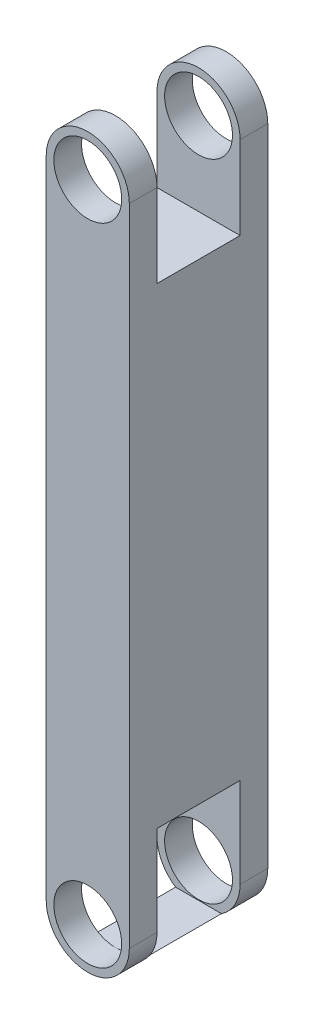
ISO-10303-21;
HEADER;
FILE_DESCRIPTION(('STEP AP214'),'2;1');
FILE_NAME('part.step','',(''),(''),'','','');
FILE_SCHEMA(('AUTOMOTIVE_DESIGN { 1 0 10303 214 1 1 1 1 }'));
ENDSEC;
DATA;
#1=APPLICATION_CONTEXT('core data for automotive mechanical design processes');
#2=APPLICATION_PROTOCOL_DEFINITION('international standard','automotive_design',2000,#1);
#3=PRODUCT_CONTEXT('',#1,'mechanical');
#4=PRODUCT('Part','Part','',(#3));
#5=PRODUCT_RELATED_PRODUCT_CATEGORY('part','',(#4));
#6=PRODUCT_DEFINITION_FORMATION('','',#4);
#7=PRODUCT_DEFINITION_CONTEXT('part definition',#1,'design');
#8=PRODUCT_DEFINITION('design','',#6,#7);
#9=PRODUCT_DEFINITION_SHAPE('','',#8);
#10=(LENGTH_UNIT() NAMED_UNIT(*) SI_UNIT(.MILLI.,.METRE.));
#11=(NAMED_UNIT(*) PLANE_ANGLE_UNIT() SI_UNIT($,.RADIAN.));
#12=(NAMED_UNIT(*) SI_UNIT($,.STERADIAN.) SOLID_ANGLE_UNIT());
#13=UNCERTAINTY_MEASURE_WITH_UNIT(LENGTH_MEASURE(1.E-05),#10,'distance_accuracy_value','');
#14=(GEOMETRIC_REPRESENTATION_CONTEXT(3) GLOBAL_UNCERTAINTY_ASSIGNED_CONTEXT((#13)) GLOBAL_UNIT_ASSIGNED_CONTEXT((#10,
#11,#12)) REPRESENTATION_CONTEXT('',''));
#15=CARTESIAN_POINT('',(0.,0.,0.));
#16=DIRECTION('',(0.,0.,1.));
#17=DIRECTION('',(1.,0.,0.));
#18=AXIS2_PLACEMENT_3D('',#15,#16,#17);
#19=CARTESIAN_POINT('',(0.,46.58,-5.));
#20=DIRECTION('',(0.,0.,1.));
#21=DIRECTION('',(1.,0.,0.));
#22=AXIS2_PLACEMENT_3D('',#19,#20,#21);
#23=CYLINDRICAL_SURFACE('',#22,3.);
#24=CARTESIAN_POINT('',(0.,46.58,3.));
#25=DIRECTION('',(0.,0.,1.));
#26=DIRECTION('',(0.,-1.,0.));
#27=AXIS2_PLACEMENT_3D('',#24,#25,#26);
#28=CIRCLE('',#27,3.);
#29=CARTESIAN_POINT('',(-3.,46.58,3.));
#30=VERTEX_POINT('',#29);
#31=CARTESIAN_POINT('',(3.,46.58,3.));
#32=VERTEX_POINT('',#31);
#33=EDGE_CURVE('E139',#30,#32,#28,.F.);
#34=ORIENTED_EDGE('',*,*,#33,.F.);
#35=DIRECTION('',(0.,0.,1.));
#36=VECTOR('',#35,1.);
#37=CARTESIAN_POINT('',(-3.,46.58,-5.));
#38=LINE('',#37,#36);
#39=CARTESIAN_POINT('',(-3.,46.58,5.));
#40=VERTEX_POINT('',#39);
#41=EDGE_CURVE('E240',#30,#40,#38,.T.);
#42=ORIENTED_EDGE('',*,*,#41,.T.);
#43=CARTESIAN_POINT('',(0.,46.58,5.));
#44=DIRECTION('',(0.,0.,1.));
#45=DIRECTION('',(-1.,0.,0.));
#46=AXIS2_PLACEMENT_3D('',#43,#44,#45);
#47=CIRCLE('',#46,3.);
#48=CARTESIAN_POINT('',(3.,46.58,5.));
#49=VERTEX_POINT('',#48);
#50=EDGE_CURVE('E210',#49,#40,#47,.T.);
#51=ORIENTED_EDGE('',*,*,#50,.F.);
#52=DIRECTION('',(0.,0.,1.));
#53=VECTOR('',#52,1.);
#54=CARTESIAN_POINT('',(3.,46.58,-5.));
#55=LINE('',#54,#53);
#56=EDGE_CURVE('E243',#32,#49,#55,.T.);
#57=ORIENTED_EDGE('',*,*,#56,.F.);
#58=EDGE_LOOP('',(#34,#42,#51,#57));
#59=FACE_BOUND('',#58,.T.);
#60=ADVANCED_FACE('F33',(#59),#23,.T.);
#61=CARTESIAN_POINT('',(0.,0.,-5.));
#62=DIRECTION('',(0.,0.,1.));
#63=DIRECTION('',(1.,0.,0.));
#64=AXIS2_PLACEMENT_3D('',#61,#62,#63);
#65=CYLINDRICAL_SURFACE('',#64,2.45);
#66=CARTESIAN_POINT('',(0.,0.,3.));
#67=DIRECTION('',(0.,0.,1.));
#68=DIRECTION('',(0.,-1.,0.));
#69=AXIS2_PLACEMENT_3D('',#66,#67,#68);
#70=CIRCLE('',#69,2.45);
#71=CARTESIAN_POINT('',(0.,-2.45,3.));
#72=VERTEX_POINT('',#71);
#73=EDGE_CURVE('E203',#72,#72,#70,.F.);
#74=ORIENTED_EDGE('',*,*,#73,.T.);
#75=EDGE_LOOP('',(#74));
#76=FACE_BOUND('',#75,.T.);
#77=CARTESIAN_POINT('',(0.,0.,5.));
#78=DIRECTION('',(0.,0.,1.));
#79=DIRECTION('',(1.,0.,0.));
#80=AXIS2_PLACEMENT_3D('',#77,#78,#79);
#81=CIRCLE('',#80,2.45);
#82=CARTESIAN_POINT('',(2.45,0.,5.));
#83=VERTEX_POINT('',#82);
#84=EDGE_CURVE('E207',#83,#83,#81,.T.);
#85=ORIENTED_EDGE('',*,*,#84,.T.);
#86=EDGE_LOOP('',(#85));
#87=FACE_BOUND('',#86,.T.);
#88=ADVANCED_FACE('F311',(#76,#87),#65,.F.);
#89=CARTESIAN_POINT('',(0.,46.58,-5.));
#90=DIRECTION('',(0.,0.,1.));
#91=DIRECTION('',(1.,0.,0.));
#92=AXIS2_PLACEMENT_3D('',#89,#90,#91);
#93=CYLINDRICAL_SURFACE('',#92,2.45);
#94=CARTESIAN_POINT('',(0.,46.58,3.));
#95=DIRECTION('',(0.,0.,1.));
#96=DIRECTION('',(0.,-1.,0.));
#97=AXIS2_PLACEMENT_3D('',#94,#95,#96);
#98=CIRCLE('',#97,2.45);
#99=CARTESIAN_POINT('',(0.,44.13,3.));
#100=VERTEX_POINT('',#99);
#101=EDGE_CURVE('E194',#100,#100,#98,.F.);
#102=ORIENTED_EDGE('',*,*,#101,.T.);
#103=EDGE_LOOP('',(#102));
#104=FACE_BOUND('',#103,.T.);
#105=CARTESIAN_POINT('',(0.,46.58,5.));
#106=DIRECTION('',(0.,0.,1.));
#107=DIRECTION('',(1.,0.,0.));
#108=AXIS2_PLACEMENT_3D('',#105,#106,#107);
#109=CIRCLE('',#108,2.45);
#110=CARTESIAN_POINT('',(2.45,46.58,5.));
#111=VERTEX_POINT('',#110);
#112=EDGE_CURVE('E204',#111,#111,#109,.T.);
#113=ORIENTED_EDGE('',*,*,#112,.T.);
#114=EDGE_LOOP('',(#113));
#115=FACE_BOUND('',#114,.T.);
#116=ADVANCED_FACE('F314',(#104,#115),#93,.F.);
#117=CARTESIAN_POINT('',(0.,46.58,-3.));
#118=DIRECTION('',(0.,0.,-1.));
#119=DIRECTION('',(0.,1.,0.));
#120=AXIS2_PLACEMENT_3D('',#117,#118,#119);
#121=CIRCLE('',#120,3.);
#122=CARTESIAN_POINT('',(3.,46.58,-3.));
#123=VERTEX_POINT('',#122);
#124=CARTESIAN_POINT('',(-3.,46.58,-3.));
#125=VERTEX_POINT('',#124);
#126=EDGE_CURVE('E192',#123,#125,#121,.F.);
#127=ORIENTED_EDGE('',*,*,#126,.F.);
#128=CARTESIAN_POINT('',(3.,46.58,-5.));
#129=VERTEX_POINT('',#128);
#130=EDGE_CURVE('E241',#129,#123,#55,.T.);
#131=ORIENTED_EDGE('',*,*,#130,.F.);
#132=CARTESIAN_POINT('',(0.,46.58,-5.));
#133=DIRECTION('',(0.,0.,1.));
#134=DIRECTION('',(-1.,0.,0.));
#135=AXIS2_PLACEMENT_3D('',#132,#133,#134);
#136=CIRCLE('',#135,3.);
#137=CARTESIAN_POINT('',(-3.,46.58,-5.));
#138=VERTEX_POINT('',#137);
#139=EDGE_CURVE('E228',#129,#138,#136,.T.);
#140=ORIENTED_EDGE('',*,*,#139,.T.);
#141=EDGE_CURVE('E252',#138,#125,#38,.T.);
#142=ORIENTED_EDGE('',*,*,#141,.T.);
#143=EDGE_LOOP('',(#127,#131,#140,#142));
#144=FACE_BOUND('',#143,.T.);
#145=ADVANCED_FACE('F35',(#144),#23,.T.);
#146=CARTESIAN_POINT('',(3.,0.,-5.));
#147=DIRECTION('',(1.,0.,0.));
#148=DIRECTION('',(0.,1.,0.));
#149=AXIS2_PLACEMENT_3D('',#146,#147,#148);
#150=PLANE('',#149);
#151=DIRECTION('',(0.,-1.,0.));
#152=VECTOR('',#151,1.);
#153=CARTESIAN_POINT('',(3.,49.58,3.));
#154=LINE('',#153,#152);
#155=CARTESIAN_POINT('',(3.,40.58,3.00000000000001));
#156=VERTEX_POINT('',#155);
#157=EDGE_CURVE('E132',#32,#156,#154,.T.);
#158=ORIENTED_EDGE('',*,*,#157,.F.);
#159=ORIENTED_EDGE('',*,*,#56,.T.);
#160=DIRECTION('',(0.,1.,0.));
#161=VECTOR('',#160,1.);
#162=CARTESIAN_POINT('',(3.,0.,5.));
#163=LINE('',#162,#161);
#164=CARTESIAN_POINT('',(3.,0.,5.));
#165=VERTEX_POINT('',#164);
#166=EDGE_CURVE('E219',#165,#49,#163,.T.);
#167=ORIENTED_EDGE('',*,*,#166,.F.);
#168=DIRECTION('',(0.,0.,1.));
#169=VECTOR('',#168,1.);
#170=CARTESIAN_POINT('',(3.,0.,-5.));
#171=LINE('',#170,#169);
#172=CARTESIAN_POINT('',(3.,0.,3.));
#173=VERTEX_POINT('',#172);
#174=EDGE_CURVE('E247',#173,#165,#171,.T.);
#175=ORIENTED_EDGE('',*,*,#174,.F.);
#176=DIRECTION('',(0.,-1.,0.));
#177=VECTOR('',#176,1.);
#178=CARTESIAN_POINT('',(3.,-2.49999999999976,3.));
#179=LINE('',#178,#177);
#180=CARTESIAN_POINT('',(3.,6.50000000000024,3.));
#181=VERTEX_POINT('',#180);
#182=EDGE_CURVE('E173',#181,#173,#179,.T.);
#183=ORIENTED_EDGE('',*,*,#182,.F.);
#184=DIRECTION('',(0.,0.,1.));
#185=VECTOR('',#184,1.);
#186=CARTESIAN_POINT('',(3.,6.50000000000022,-3.00000000000001));
#187=LINE('',#186,#185);
#188=CARTESIAN_POINT('',(3.,6.50000000000022,-3.00000000000001));
#189=VERTEX_POINT('',#188);
#190=EDGE_CURVE('E170',#189,#181,#187,.T.);
#191=ORIENTED_EDGE('',*,*,#190,.F.);
#192=DIRECTION('',(0.,1.,0.));
#193=VECTOR('',#192,1.);
#194=CARTESIAN_POINT('',(3.,-2.49999999999976,-3.));
#195=LINE('',#194,#193);
#196=CARTESIAN_POINT('',(3.,0.,-3.));
#197=VERTEX_POINT('',#196);
#198=EDGE_CURVE('E168',#197,#189,#195,.T.);
#199=ORIENTED_EDGE('',*,*,#198,.F.);
#200=CARTESIAN_POINT('',(3.,0.,-5.));
#201=VERTEX_POINT('',#200);
#202=EDGE_CURVE('E244',#201,#197,#171,.T.);
#203=ORIENTED_EDGE('',*,*,#202,.F.);
#204=DIRECTION('',(0.,1.,0.));
#205=VECTOR('',#204,1.);
#206=CARTESIAN_POINT('',(3.,0.,-5.));
#207=LINE('',#206,#205);
#208=EDGE_CURVE('E237',#201,#129,#207,.T.);
#209=ORIENTED_EDGE('',*,*,#208,.T.);
#210=ORIENTED_EDGE('',*,*,#130,.T.);
#211=DIRECTION('',(0.,1.,0.));
#212=VECTOR('',#211,1.);
#213=CARTESIAN_POINT('',(3.,49.58,-3.));
#214=LINE('',#213,#212);
#215=CARTESIAN_POINT('',(3.,40.58,-3.));
#216=VERTEX_POINT('',#215);
#217=EDGE_CURVE('E158',#216,#123,#214,.T.);
#218=ORIENTED_EDGE('',*,*,#217,.F.);
#219=DIRECTION('',(0.,0.,-1.));
#220=VECTOR('',#219,1.);
#221=CARTESIAN_POINT('',(3.,40.58,3.00000000000001));
#222=LINE('',#221,#220);
#223=EDGE_CURVE('E143',#156,#216,#222,.T.);
#224=ORIENTED_EDGE('',*,*,#223,.F.);
#225=EDGE_LOOP('',(#158,#159,#167,#175,#183,#191,#199,#203,#209,#210,#218,#224));
#226=FACE_BOUND('',#225,.T.);
#227=ADVANCED_FACE('F155',(#226),#150,.T.);
#228=CARTESIAN_POINT('',(0.,0.,-5.));
#229=DIRECTION('',(0.,0.,1.));
#230=DIRECTION('',(1.,0.,0.));
#231=AXIS2_PLACEMENT_3D('',#228,#229,#230);
#232=CYLINDRICAL_SURFACE('',#231,3.);
#233=CARTESIAN_POINT('',(0.,0.,3.));
#234=DIRECTION('',(0.,0.,1.));
#235=DIRECTION('',(0.,-1.,0.));
#236=AXIS2_PLACEMENT_3D('',#233,#234,#235);
#237=CIRCLE('',#236,3.);
#238=CARTESIAN_POINT('',(-1.65831239517806,-2.49999999999976,3.));
#239=VERTEX_POINT('',#238);
#240=CARTESIAN_POINT('',(-3.,0.,3.));
#241=VERTEX_POINT('',#240);
#242=EDGE_CURVE('E202',#239,#241,#237,.F.);
#243=ORIENTED_EDGE('',*,*,#242,.F.);
#244=DIRECTION('',(0.,0.,1.));
#245=VECTOR('',#244,1.);
#246=CARTESIAN_POINT('',(-1.65831239517806,-2.49999999999976,-5.));
#247=LINE('',#246,#245);
#248=CARTESIAN_POINT('',(-1.65831239517806,-2.49999999999976,-3.));
#249=VERTEX_POINT('',#248);
#250=EDGE_CURVE('E11',#249,#239,#247,.T.);
#251=ORIENTED_EDGE('',*,*,#250,.F.);
#252=CARTESIAN_POINT('',(0.,0.,-3.));
#253=DIRECTION('',(0.,0.,-1.));
#254=DIRECTION('',(0.,1.,0.));
#255=AXIS2_PLACEMENT_3D('',#252,#253,#254);
#256=CIRCLE('',#255,3.);
#257=CARTESIAN_POINT('',(-3.,0.,-3.));
#258=VERTEX_POINT('',#257);
#259=EDGE_CURVE('E199',#258,#249,#256,.F.);
#260=ORIENTED_EDGE('',*,*,#259,.F.);
#261=DIRECTION('',(0.,0.,1.));
#262=VECTOR('',#261,1.);
#263=CARTESIAN_POINT('',(-3.,0.,-5.));
#264=LINE('',#263,#262);
#265=CARTESIAN_POINT('',(-3.,0.,-5.));
#266=VERTEX_POINT('',#265);
#267=EDGE_CURVE('E248',#266,#258,#264,.T.);
#268=ORIENTED_EDGE('',*,*,#267,.F.);
#269=CARTESIAN_POINT('',(0.,0.,-5.));
#270=DIRECTION('',(0.,0.,1.));
#271=DIRECTION('',(1.,0.,0.));
#272=AXIS2_PLACEMENT_3D('',#269,#270,#271);
#273=CIRCLE('',#272,3.);
#274=EDGE_CURVE('E234',#266,#201,#273,.T.);
#275=ORIENTED_EDGE('',*,*,#274,.T.);
#276=ORIENTED_EDGE('',*,*,#202,.T.);
#277=CARTESIAN_POINT('',(1.65831239517806,-2.49999999999976,-3.));
#278=VERTEX_POINT('',#277);
#279=EDGE_CURVE('E197',#278,#197,#256,.F.);
#280=ORIENTED_EDGE('',*,*,#279,.F.);
#281=DIRECTION('',(0.,0.,1.));
#282=VECTOR('',#281,1.);
#283=CARTESIAN_POINT('',(1.65831239517806,-2.49999999999976,-5.));
#284=LINE('',#283,#282);
#285=CARTESIAN_POINT('',(1.65831239517806,-2.49999999999976,3.));
#286=VERTEX_POINT('',#285);
#287=EDGE_CURVE('E41',#286,#278,#284,.F.);
#288=ORIENTED_EDGE('',*,*,#287,.F.);
#289=EDGE_CURVE('E200',#173,#286,#237,.F.);
#290=ORIENTED_EDGE('',*,*,#289,.F.);
#291=ORIENTED_EDGE('',*,*,#174,.T.);
#292=CARTESIAN_POINT('',(0.,0.,5.));
#293=DIRECTION('',(0.,0.,1.));
#294=DIRECTION('',(1.,0.,0.));
#295=AXIS2_PLACEMENT_3D('',#292,#293,#294);
#296=CIRCLE('',#295,3.);
#297=CARTESIAN_POINT('',(-3.,0.,5.));
#298=VERTEX_POINT('',#297);
#299=EDGE_CURVE('E216',#298,#165,#296,.T.);
#300=ORIENTED_EDGE('',*,*,#299,.F.);
#301=EDGE_CURVE('E251',#241,#298,#264,.T.);
#302=ORIENTED_EDGE('',*,*,#301,.F.);
#303=EDGE_LOOP('',(#243,#251,#260,#268,#275,#276,#280,#288,#290,#291,#300,#302));
#304=FACE_BOUND('',#303,.T.);
#305=ADVANCED_FACE('F271',(#304),#232,.T.);
#306=CARTESIAN_POINT('',(-3.,0.,-5.));
#307=DIRECTION('',(-1.,0.,0.));
#308=DIRECTION('',(0.,-1.,0.));
#309=AXIS2_PLACEMENT_3D('',#306,#307,#308);
#310=PLANE('',#309);
#311=DIRECTION('',(0.,-1.,0.));
#312=VECTOR('',#311,1.);
#313=CARTESIAN_POINT('',(-3.,49.58,3.));
#314=LINE('',#313,#312);
#315=CARTESIAN_POINT('',(-3.,40.58,3.00000000000001));
#316=VERTEX_POINT('',#315);
#317=EDGE_CURVE('E160',#30,#316,#314,.T.);
#318=ORIENTED_EDGE('',*,*,#317,.T.);
#319=DIRECTION('',(0.,0.,-1.));
#320=VECTOR('',#319,1.);
#321=CARTESIAN_POINT('',(-3.,40.58,3.00000000000001));
#322=LINE('',#321,#320);
#323=CARTESIAN_POINT('',(-3.,40.58,-3.));
#324=VERTEX_POINT('',#323);
#325=EDGE_CURVE('E151',#316,#324,#322,.T.);
#326=ORIENTED_EDGE('',*,*,#325,.T.);
#327=DIRECTION('',(0.,1.,0.));
#328=VECTOR('',#327,1.);
#329=CARTESIAN_POINT('',(-3.,49.58,-3.));
#330=LINE('',#329,#328);
#331=EDGE_CURVE('E56',#324,#125,#330,.T.);
#332=ORIENTED_EDGE('',*,*,#331,.T.);
#333=ORIENTED_EDGE('',*,*,#141,.F.);
#334=DIRECTION('',(0.,-1.,0.));
#335=VECTOR('',#334,1.);
#336=CARTESIAN_POINT('',(-3.,0.,-5.));
#337=LINE('',#336,#335);
#338=EDGE_CURVE('E231',#138,#266,#337,.T.);
#339=ORIENTED_EDGE('',*,*,#338,.T.);
#340=ORIENTED_EDGE('',*,*,#267,.T.);
#341=DIRECTION('',(0.,1.,0.));
#342=VECTOR('',#341,1.);
#343=CARTESIAN_POINT('',(-3.,-2.49999999999976,-3.));
#344=LINE('',#343,#342);
#345=CARTESIAN_POINT('',(-3.,6.50000000000022,-3.00000000000001));
#346=VERTEX_POINT('',#345);
#347=EDGE_CURVE('E175',#258,#346,#344,.T.);
#348=ORIENTED_EDGE('',*,*,#347,.T.);
#349=DIRECTION('',(0.,0.,1.));
#350=VECTOR('',#349,1.);
#351=CARTESIAN_POINT('',(-3.,6.50000000000022,-3.00000000000001));
#352=LINE('',#351,#350);
#353=CARTESIAN_POINT('',(-3.,6.50000000000024,3.));
#354=VERTEX_POINT('',#353);
#355=EDGE_CURVE('E178',#346,#354,#352,.T.);
#356=ORIENTED_EDGE('',*,*,#355,.T.);
#357=DIRECTION('',(0.,-1.,0.));
#358=VECTOR('',#357,1.);
#359=CARTESIAN_POINT('',(-3.,-2.49999999999976,3.));
#360=LINE('',#359,#358);
#361=EDGE_CURVE('E181',#354,#241,#360,.T.);
#362=ORIENTED_EDGE('',*,*,#361,.T.);
#363=ORIENTED_EDGE('',*,*,#301,.T.);
#364=DIRECTION('',(0.,-1.,0.));
#365=VECTOR('',#364,1.);
#366=CARTESIAN_POINT('',(-3.,0.,5.));
#367=LINE('',#366,#365);
#368=EDGE_CURVE('E213',#40,#298,#367,.T.);
#369=ORIENTED_EDGE('',*,*,#368,.F.);
#370=ORIENTED_EDGE('',*,*,#41,.F.);
#371=EDGE_LOOP('',(#318,#326,#332,#333,#339,#340,#348,#356,#362,#363,#369,#370));
#372=FACE_BOUND('',#371,.T.);
#373=ADVANCED_FACE('F284',(#372),#310,.T.);
#374=CARTESIAN_POINT('',(0.,46.58,-5.));
#375=DIRECTION('',(0.,0.,-1.));
#376=DIRECTION('',(-1.,0.,0.));
#377=AXIS2_PLACEMENT_3D('',#374,#375,#376);
#378=PLANE('',#377);
#379=CARTESIAN_POINT('',(0.,46.58,-5.));
#380=DIRECTION('',(0.,0.,1.));
#381=DIRECTION('',(1.,0.,0.));
#382=AXIS2_PLACEMENT_3D('',#379,#380,#381);
#383=CIRCLE('',#382,2.45);
#384=CARTESIAN_POINT('',(2.45,46.58,-5.));
#385=VERTEX_POINT('',#384);
#386=EDGE_CURVE('E222',#385,#385,#383,.T.);
#387=ORIENTED_EDGE('',*,*,#386,.T.);
#388=EDGE_LOOP('',(#387));
#389=FACE_BOUND('',#388,.T.);
#390=CARTESIAN_POINT('',(0.,0.,-5.));
#391=DIRECTION('',(0.,0.,1.));
#392=DIRECTION('',(1.,0.,0.));
#393=AXIS2_PLACEMENT_3D('',#390,#391,#392);
#394=CIRCLE('',#393,2.45);
#395=CARTESIAN_POINT('',(2.45,0.,-5.));
#396=VERTEX_POINT('',#395);
#397=EDGE_CURVE('E225',#396,#396,#394,.T.);
#398=ORIENTED_EDGE('',*,*,#397,.T.);
#399=EDGE_LOOP('',(#398));
#400=FACE_BOUND('',#399,.T.);
#401=ORIENTED_EDGE('',*,*,#139,.F.);
#402=ORIENTED_EDGE('',*,*,#208,.F.);
#403=ORIENTED_EDGE('',*,*,#274,.F.);
#404=ORIENTED_EDGE('',*,*,#338,.F.);
#405=EDGE_LOOP('',(#401,#402,#403,#404));
#406=FACE_BOUND('',#405,.T.);
#407=ADVANCED_FACE('F290',(#389,#400,#406),#378,.T.);
#408=CARTESIAN_POINT('',(0.,0.,-3.));
#409=DIRECTION('',(0.,0.,-1.));
#410=DIRECTION('',(0.,1.,0.));
#411=AXIS2_PLACEMENT_3D('',#408,#409,#410);
#412=CIRCLE('',#411,2.45);
#413=CARTESIAN_POINT('',(0.,2.45,-3.));
#414=VERTEX_POINT('',#413);
#415=EDGE_CURVE('E196',#414,#414,#412,.F.);
#416=ORIENTED_EDGE('',*,*,#415,.T.);
#417=EDGE_LOOP('',(#416));
#418=FACE_BOUND('',#417,.T.);
#419=ORIENTED_EDGE('',*,*,#397,.F.);
#420=EDGE_LOOP('',(#419));
#421=FACE_BOUND('',#420,.T.);
#422=ADVANCED_FACE('F316',(#418,#421),#65,.F.);
#423=CARTESIAN_POINT('',(0.,46.58,-3.));
#424=DIRECTION('',(0.,0.,-1.));
#425=DIRECTION('',(0.,1.,0.));
#426=AXIS2_PLACEMENT_3D('',#423,#424,#425);
#427=CIRCLE('',#426,2.45);
#428=CARTESIAN_POINT('',(0.,49.03,-3.));
#429=VERTEX_POINT('',#428);
#430=EDGE_CURVE('E166',#429,#429,#427,.F.);
#431=ORIENTED_EDGE('',*,*,#430,.T.);
#432=EDGE_LOOP('',(#431));
#433=FACE_BOUND('',#432,.T.);
#434=ORIENTED_EDGE('',*,*,#386,.F.);
#435=EDGE_LOOP('',(#434));
#436=FACE_BOUND('',#435,.T.);
#437=ADVANCED_FACE('F320',(#433,#436),#93,.F.);
#438=CARTESIAN_POINT('',(0.,46.58,5.));
#439=DIRECTION('',(0.,0.,-1.));
#440=DIRECTION('',(-1.,0.,0.));
#441=AXIS2_PLACEMENT_3D('',#438,#439,#440);
#442=PLANE('',#441);
#443=ORIENTED_EDGE('',*,*,#50,.T.);
#444=ORIENTED_EDGE('',*,*,#368,.T.);
#445=ORIENTED_EDGE('',*,*,#299,.T.);
#446=ORIENTED_EDGE('',*,*,#166,.T.);
#447=EDGE_LOOP('',(#443,#444,#445,#446));
#448=FACE_BOUND('',#447,.T.);
#449=ORIENTED_EDGE('',*,*,#84,.F.);
#450=EDGE_LOOP('',(#449));
#451=FACE_BOUND('',#450,.T.);
#452=ORIENTED_EDGE('',*,*,#112,.F.);
#453=EDGE_LOOP('',(#452));
#454=FACE_BOUND('',#453,.T.);
#455=ADVANCED_FACE('F300',(#448,#451,#454),#442,.F.);
#456=CARTESIAN_POINT('',(-3.,49.58,3.));
#457=DIRECTION('',(0.,0.,1.));
#458=DIRECTION('',(0.,-1.,0.));
#459=AXIS2_PLACEMENT_3D('',#456,#457,#458);
#460=PLANE('',#459);
#461=ORIENTED_EDGE('',*,*,#33,.T.);
#462=ORIENTED_EDGE('',*,*,#157,.T.);
#463=DIRECTION('',(1.,0.,0.));
#464=VECTOR('',#463,1.);
#465=CARTESIAN_POINT('',(-3.,40.58,3.00000000000001));
#466=LINE('',#465,#464);
#467=EDGE_CURVE('E136',#316,#156,#466,.T.);
#468=ORIENTED_EDGE('',*,*,#467,.F.);
#469=ORIENTED_EDGE('',*,*,#317,.F.);
#470=EDGE_LOOP('',(#461,#462,#468,#469));
#471=FACE_BOUND('',#470,.T.);
#472=ORIENTED_EDGE('',*,*,#101,.F.);
#473=EDGE_LOOP('',(#472));
#474=FACE_BOUND('',#473,.T.);
#475=ADVANCED_FACE('F134',(#471,#474),#460,.F.);
#476=CARTESIAN_POINT('',(-3.,49.58,-3.));
#477=DIRECTION('',(0.,0.,-1.));
#478=DIRECTION('',(0.,1.,0.));
#479=AXIS2_PLACEMENT_3D('',#476,#477,#478);
#480=PLANE('',#479);
#481=ORIENTED_EDGE('',*,*,#126,.T.);
#482=ORIENTED_EDGE('',*,*,#331,.F.);
#483=DIRECTION('',(1.,0.,0.));
#484=VECTOR('',#483,1.);
#485=CARTESIAN_POINT('',(-3.,40.58,-3.));
#486=LINE('',#485,#484);
#487=EDGE_CURVE('E153',#324,#216,#486,.T.);
#488=ORIENTED_EDGE('',*,*,#487,.T.);
#489=ORIENTED_EDGE('',*,*,#217,.T.);
#490=EDGE_LOOP('',(#481,#482,#488,#489));
#491=FACE_BOUND('',#490,.T.);
#492=ORIENTED_EDGE('',*,*,#430,.F.);
#493=EDGE_LOOP('',(#492));
#494=FACE_BOUND('',#493,.T.);
#495=ADVANCED_FACE('F292',(#491,#494),#480,.F.);
#496=CARTESIAN_POINT('',(-3.,40.58,3.00000000000001));
#497=DIRECTION('',(0.,-1.,0.));
#498=DIRECTION('',(0.,0.,-1.));
#499=AXIS2_PLACEMENT_3D('',#496,#497,#498);
#500=PLANE('',#499);
#501=ORIENTED_EDGE('',*,*,#487,.F.);
#502=ORIENTED_EDGE('',*,*,#325,.F.);
#503=ORIENTED_EDGE('',*,*,#467,.T.);
#504=ORIENTED_EDGE('',*,*,#223,.T.);
#505=EDGE_LOOP('',(#501,#502,#503,#504));
#506=FACE_BOUND('',#505,.T.);
#507=ADVANCED_FACE('F148',(#506),#500,.F.);
#508=CARTESIAN_POINT('',(-3.,-2.49999999999976,3.));
#509=DIRECTION('',(0.,0.,1.));
#510=DIRECTION('',(0.,-1.,0.));
#511=AXIS2_PLACEMENT_3D('',#508,#509,#510);
#512=PLANE('',#511);
#513=ORIENTED_EDGE('',*,*,#242,.T.);
#514=ORIENTED_EDGE('',*,*,#361,.F.);
#515=DIRECTION('',(1.,0.,0.));
#516=VECTOR('',#515,1.);
#517=CARTESIAN_POINT('',(-3.,6.50000000000024,3.));
#518=LINE('',#517,#516);
#519=EDGE_CURVE('E186',#354,#181,#518,.T.);
#520=ORIENTED_EDGE('',*,*,#519,.T.);
#521=ORIENTED_EDGE('',*,*,#182,.T.);
#522=ORIENTED_EDGE('',*,*,#289,.T.);
#523=DIRECTION('',(1.,0.,0.));
#524=VECTOR('',#523,1.);
#525=CARTESIAN_POINT('',(-3.,-2.49999999999976,3.));
#526=LINE('',#525,#524);
#527=EDGE_CURVE('E144',#239,#286,#526,.T.);
#528=ORIENTED_EDGE('',*,*,#527,.F.);
#529=EDGE_LOOP('',(#513,#514,#520,#521,#522,#528));
#530=FACE_BOUND('',#529,.T.);
#531=ORIENTED_EDGE('',*,*,#73,.F.);
#532=EDGE_LOOP('',(#531));
#533=FACE_BOUND('',#532,.T.);
#534=ADVANCED_FACE('F305',(#530,#533),#512,.F.);
#535=CARTESIAN_POINT('',(-3.,-2.49999999999976,-3.));
#536=DIRECTION('',(0.,0.,-1.));
#537=DIRECTION('',(0.,1.,0.));
#538=AXIS2_PLACEMENT_3D('',#535,#536,#537);
#539=PLANE('',#538);
#540=ORIENTED_EDGE('',*,*,#259,.T.);
#541=DIRECTION('',(1.,0.,0.));
#542=VECTOR('',#541,1.);
#543=CARTESIAN_POINT('',(-3.,-2.49999999999976,-3.));
#544=LINE('',#543,#542);
#545=EDGE_CURVE('E48',#249,#278,#544,.T.);
#546=ORIENTED_EDGE('',*,*,#545,.T.);
#547=ORIENTED_EDGE('',*,*,#279,.T.);
#548=ORIENTED_EDGE('',*,*,#198,.T.);
#549=DIRECTION('',(1.,0.,0.));
#550=VECTOR('',#549,1.);
#551=CARTESIAN_POINT('',(-3.,6.50000000000022,-3.00000000000001));
#552=LINE('',#551,#550);
#553=EDGE_CURVE('E188',#346,#189,#552,.T.);
#554=ORIENTED_EDGE('',*,*,#553,.F.);
#555=ORIENTED_EDGE('',*,*,#347,.F.);
#556=EDGE_LOOP('',(#540,#546,#547,#548,#554,#555));
#557=FACE_BOUND('',#556,.T.);
#558=ORIENTED_EDGE('',*,*,#415,.F.);
#559=EDGE_LOOP('',(#558));
#560=FACE_BOUND('',#559,.T.);
#561=ADVANCED_FACE('F273',(#557,#560),#539,.F.);
#562=CARTESIAN_POINT('',(-3.,-2.49999999999976,-3.));
#563=DIRECTION('',(0.,-1.,0.));
#564=DIRECTION('',(0.,0.,-1.));
#565=AXIS2_PLACEMENT_3D('',#562,#563,#564);
#566=PLANE('',#565);
#567=ORIENTED_EDGE('',*,*,#287,.T.);
#568=ORIENTED_EDGE('',*,*,#545,.F.);
#569=ORIENTED_EDGE('',*,*,#250,.T.);
#570=ORIENTED_EDGE('',*,*,#527,.T.);
#571=EDGE_LOOP('',(#567,#568,#569,#570));
#572=FACE_BOUND('',#571,.T.);
#573=ADVANCED_FACE('F265',(#572),#566,.F.);
#574=CARTESIAN_POINT('',(-3.,6.50000000000022,-3.00000000000001));
#575=DIRECTION('',(0.,1.,0.));
#576=DIRECTION('',(0.,0.,1.));
#577=AXIS2_PLACEMENT_3D('',#574,#575,#576);
#578=PLANE('',#577);
#579=ORIENTED_EDGE('',*,*,#519,.F.);
#580=ORIENTED_EDGE('',*,*,#355,.F.);
#581=ORIENTED_EDGE('',*,*,#553,.T.);
#582=ORIENTED_EDGE('',*,*,#190,.T.);
#583=EDGE_LOOP('',(#579,#580,#581,#582));
#584=FACE_BOUND('',#583,.T.);
#585=ADVANCED_FACE('F280',(#584),#578,.F.);
#586=CLOSED_SHELL('',(#60,#88,#116,#145,#227,#305,#373,#407,#422,#437,#455,#475,#495,#507,#534,
#561,#573,#585));
#587=MANIFOLD_SOLID_BREP('B2',#586);
#588=ADVANCED_BREP_SHAPE_REPRESENTATION('',(#18,#587),#14);
#589=SHAPE_DEFINITION_REPRESENTATION(#9,#588);
ENDSEC;
END-ISO-10303-21;
